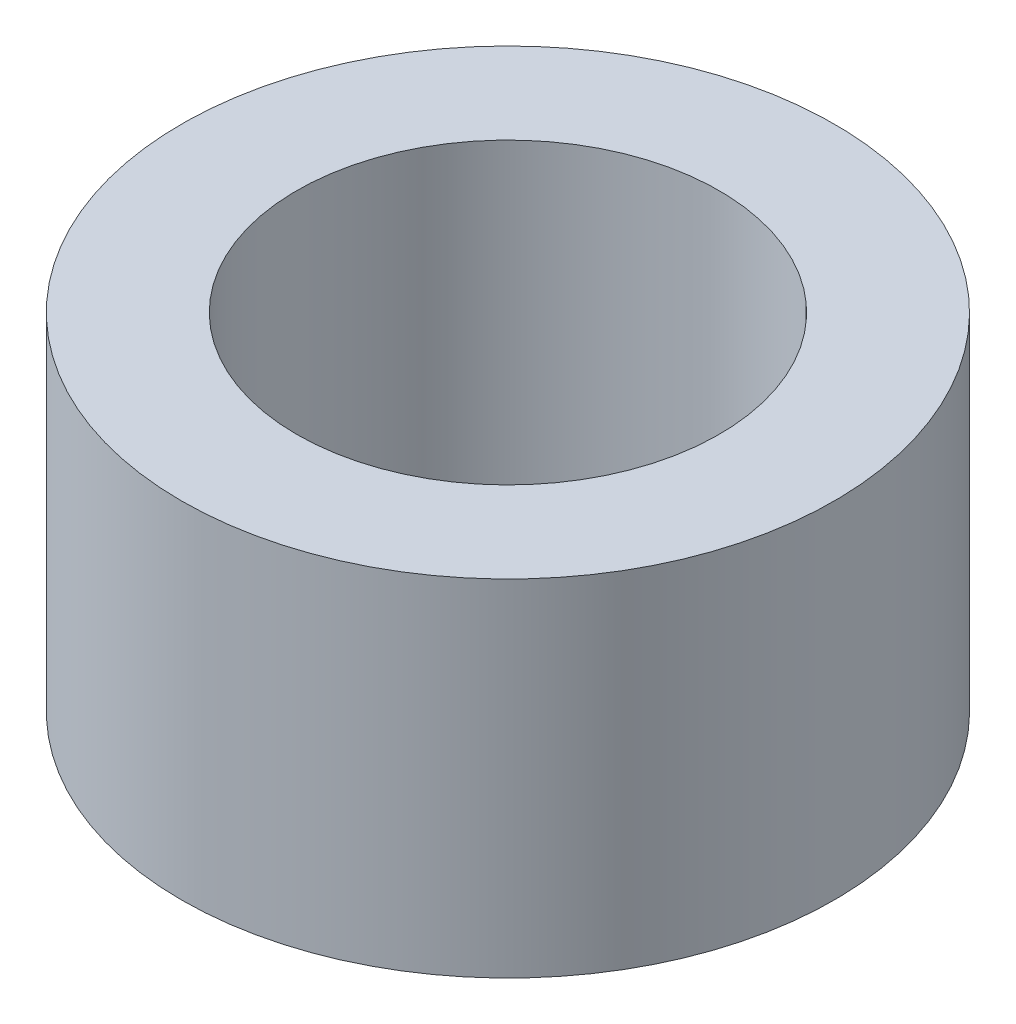
ISO-10303-21;
HEADER;
FILE_DESCRIPTION(('STEP AP214'),'2;1');
FILE_NAME('part.step','',(''),(''),'','','');
FILE_SCHEMA(('AUTOMOTIVE_DESIGN { 1 0 10303 214 1 1 1 1 }'));
ENDSEC;
DATA;
#1=APPLICATION_CONTEXT('core data for automotive mechanical design processes');
#2=APPLICATION_PROTOCOL_DEFINITION('international standard','automotive_design',2000,#1);
#3=PRODUCT_CONTEXT('',#1,'mechanical');
#4=PRODUCT('Part','Part','',(#3));
#5=PRODUCT_RELATED_PRODUCT_CATEGORY('part','',(#4));
#6=PRODUCT_DEFINITION_FORMATION('','',#4);
#7=PRODUCT_DEFINITION_CONTEXT('part definition',#1,'design');
#8=PRODUCT_DEFINITION('design','',#6,#7);
#9=PRODUCT_DEFINITION_SHAPE('','',#8);
#10=(LENGTH_UNIT() NAMED_UNIT(*) SI_UNIT(.MILLI.,.METRE.));
#11=(NAMED_UNIT(*) PLANE_ANGLE_UNIT() SI_UNIT($,.RADIAN.));
#12=(NAMED_UNIT(*) SI_UNIT($,.STERADIAN.) SOLID_ANGLE_UNIT());
#13=UNCERTAINTY_MEASURE_WITH_UNIT(LENGTH_MEASURE(1.E-05),#10,'distance_accuracy_value','');
#14=(GEOMETRIC_REPRESENTATION_CONTEXT(3) GLOBAL_UNCERTAINTY_ASSIGNED_CONTEXT((#13)) GLOBAL_UNIT_ASSIGNED_CONTEXT((#10,
#11,#12)) REPRESENTATION_CONTEXT('',''));
#15=CARTESIAN_POINT('',(0.,0.,0.));
#16=DIRECTION('',(0.,0.,1.));
#17=DIRECTION('',(1.,0.,0.));
#18=AXIS2_PLACEMENT_3D('',#15,#16,#17);
#19=CARTESIAN_POINT('',(0.,4.5,0.));
#20=DIRECTION('',(0.,1.,0.));
#21=DIRECTION('',(0.,0.,1.));
#22=AXIS2_PLACEMENT_3D('',#19,#20,#21);
#23=PLANE('',#22);
#24=CARTESIAN_POINT('',(0.,4.5,0.));
#25=DIRECTION('',(0.,1.,0.));
#26=DIRECTION('',(0.,0.,1.));
#27=AXIS2_PLACEMENT_3D('',#24,#25,#26);
#28=CIRCLE('',#27,4.25);
#29=CARTESIAN_POINT('',(0.,4.5,4.25));
#30=VERTEX_POINT('',#29);
#31=EDGE_CURVE('E10',#30,#30,#28,.T.);
#32=ORIENTED_EDGE('',*,*,#31,.T.);
#33=EDGE_LOOP('',(#32));
#34=FACE_BOUND('',#33,.T.);
#35=CARTESIAN_POINT('',(0.,4.5,0.));
#36=DIRECTION('',(0.,1.,0.));
#37=DIRECTION('',(0.,0.,1.));
#38=AXIS2_PLACEMENT_3D('',#35,#36,#37);
#39=CIRCLE('',#38,2.75);
#40=CARTESIAN_POINT('',(0.,4.5,2.75));
#41=VERTEX_POINT('',#40);
#42=EDGE_CURVE('E54',#41,#41,#39,.T.);
#43=ORIENTED_EDGE('',*,*,#42,.F.);
#44=EDGE_LOOP('',(#43));
#45=FACE_BOUND('',#44,.T.);
#46=ADVANCED_FACE('F41',(#34,#45),#23,.T.);
#47=CARTESIAN_POINT('',(0.,0.,0.));
#48=DIRECTION('',(0.,1.,0.));
#49=DIRECTION('',(0.,0.,1.));
#50=AXIS2_PLACEMENT_3D('',#47,#48,#49);
#51=PLANE('',#50);
#52=CARTESIAN_POINT('',(0.,0.,0.));
#53=DIRECTION('',(0.,1.,0.));
#54=DIRECTION('',(0.,0.,1.));
#55=AXIS2_PLACEMENT_3D('',#52,#53,#54);
#56=CIRCLE('',#55,4.25);
#57=CARTESIAN_POINT('',(0.,0.,4.25));
#58=VERTEX_POINT('',#57);
#59=EDGE_CURVE('E44',#58,#58,#56,.T.);
#60=ORIENTED_EDGE('',*,*,#59,.F.);
#61=EDGE_LOOP('',(#60));
#62=FACE_BOUND('',#61,.T.);
#63=CARTESIAN_POINT('',(0.,0.,0.));
#64=DIRECTION('',(0.,1.,0.));
#65=DIRECTION('',(0.,0.,1.));
#66=AXIS2_PLACEMENT_3D('',#63,#64,#65);
#67=CIRCLE('',#66,2.75);
#68=CARTESIAN_POINT('',(0.,0.,2.75));
#69=VERTEX_POINT('',#68);
#70=EDGE_CURVE('E60',#69,#69,#67,.T.);
#71=ORIENTED_EDGE('',*,*,#70,.T.);
#72=EDGE_LOOP('',(#71));
#73=FACE_BOUND('',#72,.T.);
#74=ADVANCED_FACE('F66',(#62,#73),#51,.F.);
#75=CARTESIAN_POINT('',(0.,4.5,0.));
#76=DIRECTION('',(0.,-1.,0.));
#77=DIRECTION('',(0.,0.,-1.));
#78=AXIS2_PLACEMENT_3D('',#75,#76,#77);
#79=CYLINDRICAL_SURFACE('',#78,4.25);
#80=ORIENTED_EDGE('',*,*,#31,.F.);
#81=EDGE_LOOP('',(#80));
#82=FACE_BOUND('',#81,.T.);
#83=ORIENTED_EDGE('',*,*,#59,.T.);
#84=EDGE_LOOP('',(#83));
#85=FACE_BOUND('',#84,.T.);
#86=ADVANCED_FACE('F43',(#82,#85),#79,.T.);
#87=CARTESIAN_POINT('',(0.,4.5,0.));
#88=DIRECTION('',(0.,-1.,0.));
#89=DIRECTION('',(0.,0.,-1.));
#90=AXIS2_PLACEMENT_3D('',#87,#88,#89);
#91=CYLINDRICAL_SURFACE('',#90,2.75);
#92=ORIENTED_EDGE('',*,*,#42,.T.);
#93=EDGE_LOOP('',(#92));
#94=FACE_BOUND('',#93,.T.);
#95=ORIENTED_EDGE('',*,*,#70,.F.);
#96=EDGE_LOOP('',(#95));
#97=FACE_BOUND('',#96,.T.);
#98=ADVANCED_FACE('F64',(#94,#97),#91,.F.);
#99=CLOSED_SHELL('',(#46,#74,#86,#98));
#100=MANIFOLD_SOLID_BREP('B2',#99);
#101=ADVANCED_BREP_SHAPE_REPRESENTATION('',(#18,#100),#14);
#102=SHAPE_DEFINITION_REPRESENTATION(#9,#101);
ENDSEC;
END-ISO-10303-21;
